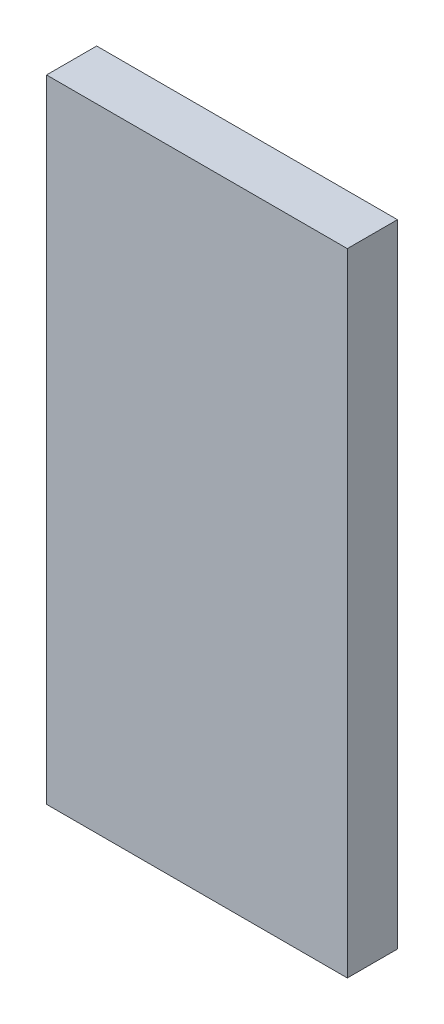
ISO-10303-21;
HEADER;
FILE_DESCRIPTION(('STEP AP214'),'2;1');
FILE_NAME('part.step','',(''),(''),'','','');
FILE_SCHEMA(('AUTOMOTIVE_DESIGN { 1 0 10303 214 1 1 1 1 }'));
ENDSEC;
DATA;
#1=APPLICATION_CONTEXT('core data for automotive mechanical design processes');
#2=APPLICATION_PROTOCOL_DEFINITION('international standard','automotive_design',2000,#1);
#3=PRODUCT_CONTEXT('',#1,'mechanical');
#4=PRODUCT('Part','Part','',(#3));
#5=PRODUCT_RELATED_PRODUCT_CATEGORY('part','',(#4));
#6=PRODUCT_DEFINITION_FORMATION('','',#4);
#7=PRODUCT_DEFINITION_CONTEXT('part definition',#1,'design');
#8=PRODUCT_DEFINITION('design','',#6,#7);
#9=PRODUCT_DEFINITION_SHAPE('','',#8);
#10=(LENGTH_UNIT() NAMED_UNIT(*) SI_UNIT(.MILLI.,.METRE.));
#11=(NAMED_UNIT(*) PLANE_ANGLE_UNIT() SI_UNIT($,.RADIAN.));
#12=(NAMED_UNIT(*) SI_UNIT($,.STERADIAN.) SOLID_ANGLE_UNIT());
#13=UNCERTAINTY_MEASURE_WITH_UNIT(LENGTH_MEASURE(1.E-05),#10,'distance_accuracy_value','');
#14=(GEOMETRIC_REPRESENTATION_CONTEXT(3) GLOBAL_UNCERTAINTY_ASSIGNED_CONTEXT((#13)) GLOBAL_UNIT_ASSIGNED_CONTEXT((#10,
#11,#12)) REPRESENTATION_CONTEXT('',''));
#15=CARTESIAN_POINT('',(0.,0.,0.));
#16=DIRECTION('',(0.,0.,1.));
#17=DIRECTION('',(1.,0.,0.));
#18=AXIS2_PLACEMENT_3D('',#15,#16,#17);
#19=CARTESIAN_POINT('',(-28.030570538091,40.707067027243,5.));
#20=DIRECTION('',(1.,0.,0.));
#21=DIRECTION('',(0.,1.,0.));
#22=AXIS2_PLACEMENT_3D('',#19,#20,#21);
#23=PLANE('',#22);
#24=DIRECTION('',(0.,-1.,0.));
#25=VECTOR('',#24,1.);
#26=CARTESIAN_POINT('',(-28.030570538091,40.707067027243,0.));
#27=LINE('',#26,#25);
#28=CARTESIAN_POINT('',(-28.030570538091,40.707067027243,0.));
#29=VERTEX_POINT('',#28);
#30=CARTESIAN_POINT('',(-28.030570538091,-22.2929329727571,0.));
#31=VERTEX_POINT('',#30);
#32=EDGE_CURVE('E95',#29,#31,#27,.T.);
#33=ORIENTED_EDGE('',*,*,#32,.T.);
#34=DIRECTION('',(0.,0.,-1.));
#35=VECTOR('',#34,1.);
#36=CARTESIAN_POINT('',(-28.030570538091,-22.2929329727571,5.));
#37=LINE('',#36,#35);
#38=CARTESIAN_POINT('',(-28.030570538091,-22.2929329727571,5.));
#39=VERTEX_POINT('',#38);
#40=EDGE_CURVE('E11',#39,#31,#37,.T.);
#41=ORIENTED_EDGE('',*,*,#40,.F.);
#42=DIRECTION('',(0.,-1.,0.));
#43=VECTOR('',#42,1.);
#44=CARTESIAN_POINT('',(-28.030570538091,40.707067027243,5.));
#45=LINE('',#44,#43);
#46=CARTESIAN_POINT('',(-28.030570538091,40.707067027243,5.));
#47=VERTEX_POINT('',#46);
#48=EDGE_CURVE('E83',#47,#39,#45,.T.);
#49=ORIENTED_EDGE('',*,*,#48,.F.);
#50=DIRECTION('',(0.,0.,-1.));
#51=VECTOR('',#50,1.);
#52=CARTESIAN_POINT('',(-28.030570538091,40.707067027243,5.));
#53=LINE('',#52,#51);
#54=EDGE_CURVE('E91',#47,#29,#53,.T.);
#55=ORIENTED_EDGE('',*,*,#54,.T.);
#56=EDGE_LOOP('',(#33,#41,#49,#55));
#57=FACE_BOUND('',#56,.T.);
#58=ADVANCED_FACE('F32',(#57),#23,.F.);
#59=CARTESIAN_POINT('',(-28.030570538091,-22.2929329727571,5.));
#60=DIRECTION('',(0.,1.,0.));
#61=DIRECTION('',(-1.,0.,0.));
#62=AXIS2_PLACEMENT_3D('',#59,#60,#61);
#63=PLANE('',#62);
#64=DIRECTION('',(1.,0.,0.));
#65=VECTOR('',#64,1.);
#66=CARTESIAN_POINT('',(-28.030570538091,-22.2929329727571,0.));
#67=LINE('',#66,#65);
#68=CARTESIAN_POINT('',(1.96942946190897,-22.2929329727571,0.));
#69=VERTEX_POINT('',#68);
#70=EDGE_CURVE('E87',#31,#69,#67,.T.);
#71=ORIENTED_EDGE('',*,*,#70,.T.);
#72=DIRECTION('',(0.,0.,-1.));
#73=VECTOR('',#72,1.);
#74=CARTESIAN_POINT('',(1.96942946190897,-22.2929329727571,5.));
#75=LINE('',#74,#73);
#76=CARTESIAN_POINT('',(1.96942946190897,-22.2929329727571,5.));
#77=VERTEX_POINT('',#76);
#78=EDGE_CURVE('E40',#77,#69,#75,.T.);
#79=ORIENTED_EDGE('',*,*,#78,.F.);
#80=DIRECTION('',(1.,0.,0.));
#81=VECTOR('',#80,1.);
#82=CARTESIAN_POINT('',(-28.030570538091,-22.2929329727571,5.));
#83=LINE('',#82,#81);
#84=EDGE_CURVE('E78',#39,#77,#83,.T.);
#85=ORIENTED_EDGE('',*,*,#84,.F.);
#86=ORIENTED_EDGE('',*,*,#40,.T.);
#87=EDGE_LOOP('',(#71,#79,#85,#86));
#88=FACE_BOUND('',#87,.T.);
#89=ADVANCED_FACE('F86',(#88),#63,.F.);
#90=CARTESIAN_POINT('',(1.96942946190896,40.707067027243,5.));
#91=DIRECTION('',(-1.,0.,0.));
#92=DIRECTION('',(0.,-1.,0.));
#93=AXIS2_PLACEMENT_3D('',#90,#91,#92);
#94=PLANE('',#93);
#95=DIRECTION('',(0.,1.,0.));
#96=VECTOR('',#95,1.);
#97=CARTESIAN_POINT('',(1.96942946190896,40.707067027243,0.));
#98=LINE('',#97,#96);
#99=CARTESIAN_POINT('',(1.96942946190896,40.707067027243,0.));
#100=VERTEX_POINT('',#99);
#101=EDGE_CURVE('E65',#69,#100,#98,.T.);
#102=ORIENTED_EDGE('',*,*,#101,.T.);
#103=DIRECTION('',(0.,0.,-1.));
#104=VECTOR('',#103,1.);
#105=CARTESIAN_POINT('',(1.96942946190896,40.707067027243,5.));
#106=LINE('',#105,#104);
#107=CARTESIAN_POINT('',(1.96942946190896,40.707067027243,5.));
#108=VERTEX_POINT('',#107);
#109=EDGE_CURVE('E88',#108,#100,#106,.T.);
#110=ORIENTED_EDGE('',*,*,#109,.F.);
#111=DIRECTION('',(0.,1.,0.));
#112=VECTOR('',#111,1.);
#113=CARTESIAN_POINT('',(1.96942946190896,40.707067027243,5.));
#114=LINE('',#113,#112);
#115=EDGE_CURVE('E81',#77,#108,#114,.T.);
#116=ORIENTED_EDGE('',*,*,#115,.F.);
#117=ORIENTED_EDGE('',*,*,#78,.T.);
#118=EDGE_LOOP('',(#102,#110,#116,#117));
#119=FACE_BOUND('',#118,.T.);
#120=ADVANCED_FACE('F89',(#119),#94,.F.);
#121=CARTESIAN_POINT('',(-28.030570538091,40.707067027243,5.));
#122=DIRECTION('',(0.,-1.,0.));
#123=DIRECTION('',(1.,0.,0.));
#124=AXIS2_PLACEMENT_3D('',#121,#122,#123);
#125=PLANE('',#124);
#126=DIRECTION('',(-1.,0.,0.));
#127=VECTOR('',#126,1.);
#128=CARTESIAN_POINT('',(-28.030570538091,40.707067027243,0.));
#129=LINE('',#128,#127);
#130=EDGE_CURVE('E71',#100,#29,#129,.T.);
#131=ORIENTED_EDGE('',*,*,#130,.T.);
#132=ORIENTED_EDGE('',*,*,#54,.F.);
#133=DIRECTION('',(-1.,0.,0.));
#134=VECTOR('',#133,1.);
#135=CARTESIAN_POINT('',(-28.030570538091,40.707067027243,5.));
#136=LINE('',#135,#134);
#137=EDGE_CURVE('E48',#108,#47,#136,.T.);
#138=ORIENTED_EDGE('',*,*,#137,.F.);
#139=ORIENTED_EDGE('',*,*,#109,.T.);
#140=EDGE_LOOP('',(#131,#132,#138,#139));
#141=FACE_BOUND('',#140,.T.);
#142=ADVANCED_FACE('F102',(#141),#125,.F.);
#143=CARTESIAN_POINT('',(0.,0.,5.));
#144=DIRECTION('',(0.,0.,1.));
#145=DIRECTION('',(1.,0.,0.));
#146=AXIS2_PLACEMENT_3D('',#143,#144,#145);
#147=PLANE('',#146);
#148=ORIENTED_EDGE('',*,*,#48,.T.);
#149=ORIENTED_EDGE('',*,*,#84,.T.);
#150=ORIENTED_EDGE('',*,*,#115,.T.);
#151=ORIENTED_EDGE('',*,*,#137,.T.);
#152=EDGE_LOOP('',(#148,#149,#150,#151));
#153=FACE_BOUND('',#152,.T.);
#154=ADVANCED_FACE('F79',(#153),#147,.T.);
#155=CARTESIAN_POINT('',(0.,0.,0.));
#156=DIRECTION('',(0.,0.,1.));
#157=DIRECTION('',(1.,0.,0.));
#158=AXIS2_PLACEMENT_3D('',#155,#156,#157);
#159=PLANE('',#158);
#160=ORIENTED_EDGE('',*,*,#32,.F.);
#161=ORIENTED_EDGE('',*,*,#130,.F.);
#162=ORIENTED_EDGE('',*,*,#101,.F.);
#163=ORIENTED_EDGE('',*,*,#70,.F.);
#164=EDGE_LOOP('',(#160,#161,#162,#163));
#165=FACE_BOUND('',#164,.T.);
#166=ADVANCED_FACE('F105',(#165),#159,.F.);
#167=CLOSED_SHELL('',(#58,#89,#120,#142,#154,#166));
#168=MANIFOLD_SOLID_BREP('B2',#167);
#169=ADVANCED_BREP_SHAPE_REPRESENTATION('',(#18,#168),#14);
#170=SHAPE_DEFINITION_REPRESENTATION(#9,#169);
ENDSEC;
END-ISO-10303-21;
